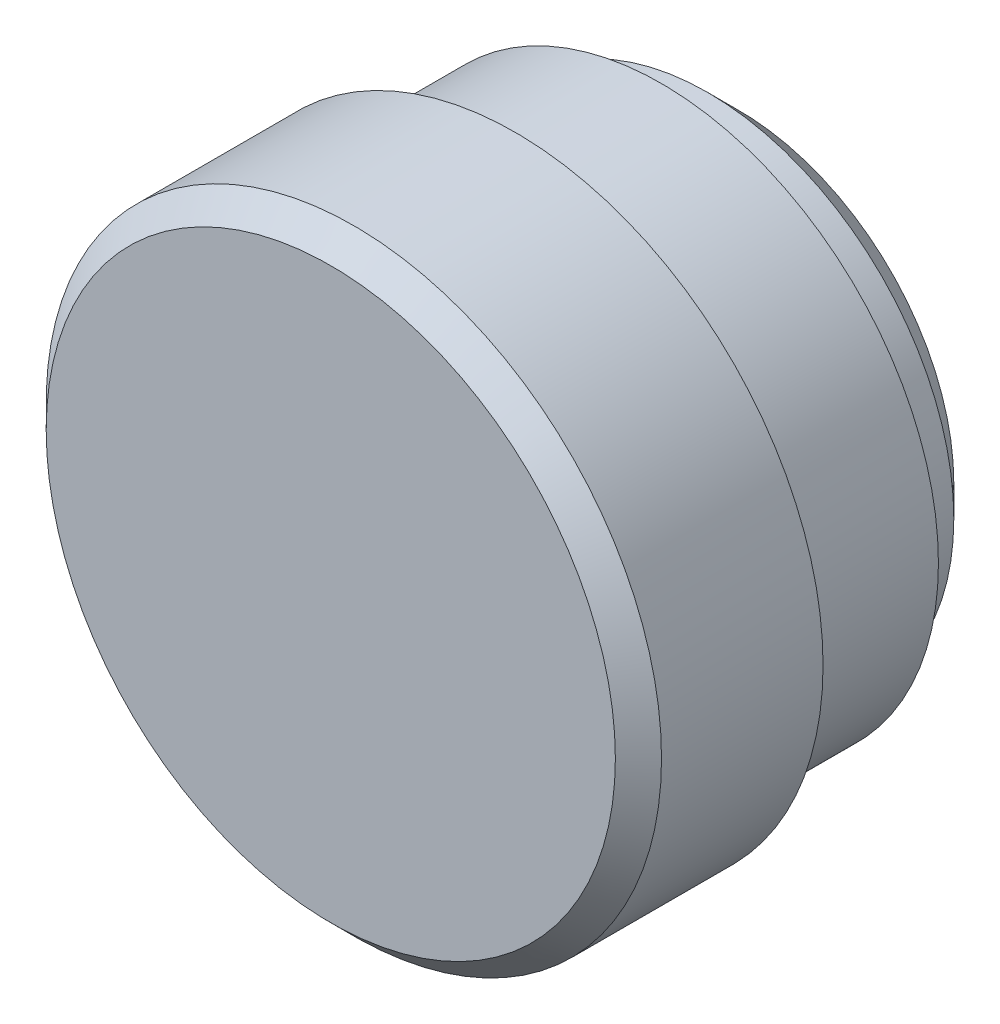
ISO-10303-21;
HEADER;
FILE_DESCRIPTION(('STEP AP214'),'2;1');
FILE_NAME('part.step','',(''),(''),'','','');
FILE_SCHEMA(('AUTOMOTIVE_DESIGN { 1 0 10303 214 1 1 1 1 }'));
ENDSEC;
DATA;
#1=APPLICATION_CONTEXT('core data for automotive mechanical design processes');
#2=APPLICATION_PROTOCOL_DEFINITION('international standard','automotive_design',2000,#1);
#3=PRODUCT_CONTEXT('',#1,'mechanical');
#4=PRODUCT('Part','Part','',(#3));
#5=PRODUCT_RELATED_PRODUCT_CATEGORY('part','',(#4));
#6=PRODUCT_DEFINITION_FORMATION('','',#4);
#7=PRODUCT_DEFINITION_CONTEXT('part definition',#1,'design');
#8=PRODUCT_DEFINITION('design','',#6,#7);
#9=PRODUCT_DEFINITION_SHAPE('','',#8);
#10=(LENGTH_UNIT() NAMED_UNIT(*) SI_UNIT(.MILLI.,.METRE.));
#11=(NAMED_UNIT(*) PLANE_ANGLE_UNIT() SI_UNIT($,.RADIAN.));
#12=(NAMED_UNIT(*) SI_UNIT($,.STERADIAN.) SOLID_ANGLE_UNIT());
#13=UNCERTAINTY_MEASURE_WITH_UNIT(LENGTH_MEASURE(1.E-05),#10,'distance_accuracy_value','');
#14=(GEOMETRIC_REPRESENTATION_CONTEXT(3) GLOBAL_UNCERTAINTY_ASSIGNED_CONTEXT((#13)) GLOBAL_UNIT_ASSIGNED_CONTEXT((#10,
#11,#12)) REPRESENTATION_CONTEXT('',''));
#15=CARTESIAN_POINT('',(0.,0.,0.));
#16=DIRECTION('',(0.,0.,1.));
#17=DIRECTION('',(1.,0.,0.));
#18=AXIS2_PLACEMENT_3D('',#15,#16,#17);
#19=CARTESIAN_POINT('',(0.,0.,2.5));
#20=DIRECTION('',(0.,0.,-1.));
#21=DIRECTION('',(-1.,0.,0.));
#22=AXIS2_PLACEMENT_3D('',#19,#20,#21);
#23=CYLINDRICAL_SURFACE('',#22,8.);
#24=CARTESIAN_POINT('',(0.,0.,1.));
#25=DIRECTION('',(0.,0.,1.));
#26=DIRECTION('',(1.,0.,0.));
#27=AXIS2_PLACEMENT_3D('',#24,#25,#26);
#28=CIRCLE('',#27,8.);
#29=CARTESIAN_POINT('',(8.,0.,1.));
#30=VERTEX_POINT('',#29);
#31=EDGE_CURVE('E130',#30,#30,#28,.T.);
#32=ORIENTED_EDGE('',*,*,#31,.T.);
#33=EDGE_LOOP('',(#32));
#34=FACE_BOUND('',#33,.T.);
#35=CARTESIAN_POINT('',(0.,0.,2.5));
#36=DIRECTION('',(0.,0.,1.));
#37=DIRECTION('',(1.,0.,0.));
#38=AXIS2_PLACEMENT_3D('',#35,#36,#37);
#39=CIRCLE('',#38,8.);
#40=CARTESIAN_POINT('',(8.,0.,2.5));
#41=VERTEX_POINT('',#40);
#42=EDGE_CURVE('E131',#41,#41,#39,.T.);
#43=ORIENTED_EDGE('',*,*,#42,.F.);
#44=EDGE_LOOP('',(#43));
#45=FACE_BOUND('',#44,.T.);
#46=ADVANCED_FACE('F41',(#34,#45),#23,.T.);
#47=CARTESIAN_POINT('',(0.,0.,0.));
#48=DIRECTION('',(0.,0.,1.));
#49=DIRECTION('',(1.,0.,0.));
#50=AXIS2_PLACEMENT_3D('',#47,#48,#49);
#51=PLANE('',#50);
#52=CARTESIAN_POINT('',(0.,0.,0.));
#53=DIRECTION('',(0.,0.,1.));
#54=DIRECTION('',(1.,0.,0.));
#55=AXIS2_PLACEMENT_3D('',#52,#53,#54);
#56=CIRCLE('',#55,7.);
#57=CARTESIAN_POINT('',(7.,0.,0.));
#58=VERTEX_POINT('',#57);
#59=EDGE_CURVE('E141',#58,#58,#56,.F.);
#60=ORIENTED_EDGE('',*,*,#59,.T.);
#61=EDGE_LOOP('',(#60));
#62=FACE_BOUND('',#61,.T.);
#63=DIRECTION('',(-1.,0.,0.));
#64=VECTOR('',#63,1.);
#65=CARTESIAN_POINT('',(2.5,-2.5,0.));
#66=LINE('',#65,#64);
#67=CARTESIAN_POINT('',(2.5,-2.5,0.));
#68=VERTEX_POINT('',#67);
#69=CARTESIAN_POINT('',(-2.5,-2.5,0.));
#70=VERTEX_POINT('',#69);
#71=EDGE_CURVE('E92',#68,#70,#66,.T.);
#72=ORIENTED_EDGE('',*,*,#71,.F.);
#73=DIRECTION('',(0.,-1.,0.));
#74=VECTOR('',#73,1.);
#75=CARTESIAN_POINT('',(2.5,2.5,0.));
#76=LINE('',#75,#74);
#77=CARTESIAN_POINT('',(2.5,2.5,0.));
#78=VERTEX_POINT('',#77);
#79=EDGE_CURVE('E57',#78,#68,#76,.T.);
#80=ORIENTED_EDGE('',*,*,#79,.F.);
#81=DIRECTION('',(1.,0.,0.));
#82=VECTOR('',#81,1.);
#83=CARTESIAN_POINT('',(2.5,2.5,0.));
#84=LINE('',#83,#82);
#85=CARTESIAN_POINT('',(-2.5,2.5,0.));
#86=VERTEX_POINT('',#85);
#87=EDGE_CURVE('E108',#86,#78,#84,.T.);
#88=ORIENTED_EDGE('',*,*,#87,.F.);
#89=DIRECTION('',(0.,1.,0.));
#90=VECTOR('',#89,1.);
#91=CARTESIAN_POINT('',(-2.5,2.5,0.));
#92=LINE('',#91,#90);
#93=EDGE_CURVE('E114',#70,#86,#92,.T.);
#94=ORIENTED_EDGE('',*,*,#93,.F.);
#95=EDGE_LOOP('',(#72,#80,#88,#94));
#96=FACE_BOUND('',#95,.T.);
#97=ADVANCED_FACE('F158',(#62,#96),#51,.F.);
#98=CARTESIAN_POINT('',(0.,0.,7.));
#99=DIRECTION('',(0.,0.,-1.));
#100=DIRECTION('',(-1.,0.,0.));
#101=AXIS2_PLACEMENT_3D('',#98,#99,#100);
#102=CYLINDRICAL_SURFACE('',#101,9.);
#103=CARTESIAN_POINT('',(0.,0.,7.));
#104=DIRECTION('',(0.,0.,1.));
#105=DIRECTION('',(1.,0.,0.));
#106=AXIS2_PLACEMENT_3D('',#103,#104,#105);
#107=CIRCLE('',#106,9.);
#108=CARTESIAN_POINT('',(9.,0.,7.));
#109=VERTEX_POINT('',#108);
#110=EDGE_CURVE('E132',#109,#109,#107,.T.);
#111=ORIENTED_EDGE('',*,*,#110,.F.);
#112=EDGE_LOOP('',(#111));
#113=FACE_BOUND('',#112,.T.);
#114=CARTESIAN_POINT('',(0.,0.,2.5));
#115=DIRECTION('',(0.,0.,1.));
#116=DIRECTION('',(1.,0.,0.));
#117=AXIS2_PLACEMENT_3D('',#114,#115,#116);
#118=CIRCLE('',#117,9.);
#119=CARTESIAN_POINT('',(9.,0.,2.5));
#120=VERTEX_POINT('',#119);
#121=EDGE_CURVE('E126',#120,#120,#118,.T.);
#122=ORIENTED_EDGE('',*,*,#121,.T.);
#123=EDGE_LOOP('',(#122));
#124=FACE_BOUND('',#123,.T.);
#125=ADVANCED_FACE('F165',(#113,#124),#102,.T.);
#126=CARTESIAN_POINT('',(0.,0.,7.));
#127=DIRECTION('',(0.,0.,1.));
#128=DIRECTION('',(1.,0.,0.));
#129=AXIS2_PLACEMENT_3D('',#126,#127,#128);
#130=PLANE('',#129);
#131=CARTESIAN_POINT('',(0.,0.,7.));
#132=DIRECTION('',(0.,0.,1.));
#133=DIRECTION('',(1.,0.,0.));
#134=AXIS2_PLACEMENT_3D('',#131,#132,#133);
#135=CIRCLE('',#134,8.);
#136=CARTESIAN_POINT('',(8.,0.,7.));
#137=VERTEX_POINT('',#136);
#138=EDGE_CURVE('E127',#137,#137,#135,.T.);
#139=ORIENTED_EDGE('',*,*,#138,.F.);
#140=EDGE_LOOP('',(#139));
#141=FACE_BOUND('',#140,.T.);
#142=ORIENTED_EDGE('',*,*,#110,.T.);
#143=EDGE_LOOP('',(#142));
#144=FACE_BOUND('',#143,.T.);
#145=ADVANCED_FACE('F177',(#141,#144),#130,.T.);
#146=CARTESIAN_POINT('',(0.,0.,2.5));
#147=DIRECTION('',(0.,0.,1.));
#148=DIRECTION('',(1.,0.,0.));
#149=AXIS2_PLACEMENT_3D('',#146,#147,#148);
#150=PLANE('',#149);
#151=ORIENTED_EDGE('',*,*,#42,.T.);
#152=EDGE_LOOP('',(#151));
#153=FACE_BOUND('',#152,.T.);
#154=ORIENTED_EDGE('',*,*,#121,.F.);
#155=EDGE_LOOP('',(#154));
#156=FACE_BOUND('',#155,.T.);
#157=ADVANCED_FACE('F179',(#153,#156),#150,.F.);
#158=CARTESIAN_POINT('',(0.,0.,7.25));
#159=DIRECTION('',(0.,0.,-1.));
#160=DIRECTION('',(-1.,0.,0.));
#161=AXIS2_PLACEMENT_3D('',#158,#159,#160);
#162=CYLINDRICAL_SURFACE('',#161,8.);
#163=CARTESIAN_POINT('',(0.,0.,7.25));
#164=DIRECTION('',(0.,0.,1.));
#165=DIRECTION('',(1.,0.,0.));
#166=AXIS2_PLACEMENT_3D('',#163,#164,#165);
#167=CIRCLE('',#166,8.);
#168=CARTESIAN_POINT('',(8.,0.,7.25));
#169=VERTEX_POINT('',#168);
#170=EDGE_CURVE('E123',#169,#169,#167,.T.);
#171=ORIENTED_EDGE('',*,*,#170,.F.);
#172=EDGE_LOOP('',(#171));
#173=FACE_BOUND('',#172,.T.);
#174=ORIENTED_EDGE('',*,*,#138,.T.);
#175=EDGE_LOOP('',(#174));
#176=FACE_BOUND('',#175,.T.);
#177=ADVANCED_FACE('F182',(#173,#176),#162,.T.);
#178=CARTESIAN_POINT('',(0.,0.,13.25));
#179=DIRECTION('',(0.,0.,-1.));
#180=DIRECTION('',(-1.,0.,0.));
#181=AXIS2_PLACEMENT_3D('',#178,#179,#180);
#182=CYLINDRICAL_SURFACE('',#181,10.);
#183=CARTESIAN_POINT('',(0.,0.,12.5));
#184=DIRECTION('',(0.,0.,1.));
#185=DIRECTION('',(1.,0.,0.));
#186=AXIS2_PLACEMENT_3D('',#183,#184,#185);
#187=CIRCLE('',#186,10.);
#188=CARTESIAN_POINT('',(10.,0.,12.5));
#189=VERTEX_POINT('',#188);
#190=EDGE_CURVE('E11',#189,#189,#187,.F.);
#191=ORIENTED_EDGE('',*,*,#190,.T.);
#192=EDGE_LOOP('',(#191));
#193=FACE_BOUND('',#192,.T.);
#194=CARTESIAN_POINT('',(0.,0.,7.25));
#195=DIRECTION('',(0.,0.,1.));
#196=DIRECTION('',(1.,0.,0.));
#197=AXIS2_PLACEMENT_3D('',#194,#195,#196);
#198=CIRCLE('',#197,10.);
#199=CARTESIAN_POINT('',(10.,0.,7.25));
#200=VERTEX_POINT('',#199);
#201=EDGE_CURVE('E118',#200,#200,#198,.T.);
#202=ORIENTED_EDGE('',*,*,#201,.T.);
#203=EDGE_LOOP('',(#202));
#204=FACE_BOUND('',#203,.T.);
#205=ADVANCED_FACE('F189',(#193,#204),#182,.T.);
#206=CARTESIAN_POINT('',(0.,0.,13.25));
#207=DIRECTION('',(0.,0.,1.));
#208=DIRECTION('',(1.,0.,0.));
#209=AXIS2_PLACEMENT_3D('',#206,#207,#208);
#210=PLANE('',#209);
#211=CARTESIAN_POINT('',(0.,0.,13.25));
#212=DIRECTION('',(0.,0.,1.));
#213=DIRECTION('',(1.,0.,0.));
#214=AXIS2_PLACEMENT_3D('',#211,#212,#213);
#215=CIRCLE('',#214,9.25);
#216=CARTESIAN_POINT('',(9.25,0.,13.25));
#217=VERTEX_POINT('',#216);
#218=EDGE_CURVE('E50',#217,#217,#215,.T.);
#219=ORIENTED_EDGE('',*,*,#218,.T.);
#220=EDGE_LOOP('',(#219));
#221=FACE_BOUND('',#220,.T.);
#222=ADVANCED_FACE('F146',(#221),#210,.T.);
#223=CARTESIAN_POINT('',(0.,0.,7.25));
#224=DIRECTION('',(0.,0.,1.));
#225=DIRECTION('',(1.,0.,0.));
#226=AXIS2_PLACEMENT_3D('',#223,#224,#225);
#227=PLANE('',#226);
#228=ORIENTED_EDGE('',*,*,#170,.T.);
#229=EDGE_LOOP('',(#228));
#230=FACE_BOUND('',#229,.T.);
#231=ORIENTED_EDGE('',*,*,#201,.F.);
#232=EDGE_LOOP('',(#231));
#233=FACE_BOUND('',#232,.T.);
#234=ADVANCED_FACE('F194',(#230,#233),#227,.F.);
#235=CARTESIAN_POINT('',(2.5,2.5,5.));
#236=DIRECTION('',(1.,0.,0.));
#237=DIRECTION('',(0.,0.,-1.));
#238=AXIS2_PLACEMENT_3D('',#235,#236,#237);
#239=PLANE('',#238);
#240=ORIENTED_EDGE('',*,*,#79,.T.);
#241=DIRECTION('',(0.,0.,-1.));
#242=VECTOR('',#241,1.);
#243=CARTESIAN_POINT('',(2.5,-2.5,5.));
#244=LINE('',#243,#242);
#245=CARTESIAN_POINT('',(2.5,-2.5,5.));
#246=VERTEX_POINT('',#245);
#247=EDGE_CURVE('E80',#246,#68,#244,.T.);
#248=ORIENTED_EDGE('',*,*,#247,.F.);
#249=DIRECTION('',(0.,-1.,0.));
#250=VECTOR('',#249,1.);
#251=CARTESIAN_POINT('',(2.5,2.5,5.));
#252=LINE('',#251,#250);
#253=CARTESIAN_POINT('',(2.5,2.5,5.));
#254=VERTEX_POINT('',#253);
#255=EDGE_CURVE('E106',#254,#246,#252,.T.);
#256=ORIENTED_EDGE('',*,*,#255,.F.);
#257=DIRECTION('',(0.,0.,-1.));
#258=VECTOR('',#257,1.);
#259=CARTESIAN_POINT('',(2.5,2.5,5.));
#260=LINE('',#259,#258);
#261=EDGE_CURVE('E65',#254,#78,#260,.T.);
#262=ORIENTED_EDGE('',*,*,#261,.T.);
#263=EDGE_LOOP('',(#240,#248,#256,#262));
#264=FACE_BOUND('',#263,.T.);
#265=ADVANCED_FACE('F197',(#264),#239,.F.);
#266=CARTESIAN_POINT('',(2.5,2.5,5.));
#267=DIRECTION('',(0.,1.,0.));
#268=DIRECTION('',(0.,0.,1.));
#269=AXIS2_PLACEMENT_3D('',#266,#267,#268);
#270=PLANE('',#269);
#271=ORIENTED_EDGE('',*,*,#87,.T.);
#272=ORIENTED_EDGE('',*,*,#261,.F.);
#273=DIRECTION('',(1.,0.,0.));
#274=VECTOR('',#273,1.);
#275=CARTESIAN_POINT('',(2.5,2.5,5.));
#276=LINE('',#275,#274);
#277=CARTESIAN_POINT('',(-2.5,2.5,5.));
#278=VERTEX_POINT('',#277);
#279=EDGE_CURVE('E103',#278,#254,#276,.T.);
#280=ORIENTED_EDGE('',*,*,#279,.F.);
#281=DIRECTION('',(0.,0.,-1.));
#282=VECTOR('',#281,1.);
#283=CARTESIAN_POINT('',(-2.5,2.5,5.));
#284=LINE('',#283,#282);
#285=EDGE_CURVE('E96',#278,#86,#284,.T.);
#286=ORIENTED_EDGE('',*,*,#285,.T.);
#287=EDGE_LOOP('',(#271,#272,#280,#286));
#288=FACE_BOUND('',#287,.T.);
#289=ADVANCED_FACE('F202',(#288),#270,.F.);
#290=CARTESIAN_POINT('',(-2.5,2.5,5.));
#291=DIRECTION('',(-1.,0.,0.));
#292=DIRECTION('',(0.,0.,1.));
#293=AXIS2_PLACEMENT_3D('',#290,#291,#292);
#294=PLANE('',#293);
#295=ORIENTED_EDGE('',*,*,#93,.T.);
#296=ORIENTED_EDGE('',*,*,#285,.F.);
#297=DIRECTION('',(0.,1.,0.));
#298=VECTOR('',#297,1.);
#299=CARTESIAN_POINT('',(-2.5,2.5,5.));
#300=LINE('',#299,#298);
#301=CARTESIAN_POINT('',(-2.5,-2.5,5.));
#302=VERTEX_POINT('',#301);
#303=EDGE_CURVE('E99',#302,#278,#300,.T.);
#304=ORIENTED_EDGE('',*,*,#303,.F.);
#305=DIRECTION('',(0.,0.,-1.));
#306=VECTOR('',#305,1.);
#307=CARTESIAN_POINT('',(-2.5,-2.5,5.));
#308=LINE('',#307,#306);
#309=EDGE_CURVE('E85',#302,#70,#308,.T.);
#310=ORIENTED_EDGE('',*,*,#309,.T.);
#311=EDGE_LOOP('',(#295,#296,#304,#310));
#312=FACE_BOUND('',#311,.T.);
#313=ADVANCED_FACE('F100',(#312),#294,.F.);
#314=CARTESIAN_POINT('',(2.5,-2.5,5.));
#315=DIRECTION('',(0.,-1.,0.));
#316=DIRECTION('',(0.,0.,-1.));
#317=AXIS2_PLACEMENT_3D('',#314,#315,#316);
#318=PLANE('',#317);
#319=ORIENTED_EDGE('',*,*,#71,.T.);
#320=ORIENTED_EDGE('',*,*,#309,.F.);
#321=DIRECTION('',(-1.,0.,0.));
#322=VECTOR('',#321,1.);
#323=CARTESIAN_POINT('',(2.5,-2.5,5.));
#324=LINE('',#323,#322);
#325=EDGE_CURVE('E89',#246,#302,#324,.T.);
#326=ORIENTED_EDGE('',*,*,#325,.F.);
#327=ORIENTED_EDGE('',*,*,#247,.T.);
#328=EDGE_LOOP('',(#319,#320,#326,#327));
#329=FACE_BOUND('',#328,.T.);
#330=ADVANCED_FACE('F87',(#329),#318,.F.);
#331=CARTESIAN_POINT('',(0.,0.,5.));
#332=DIRECTION('',(0.,0.,-1.));
#333=DIRECTION('',(-1.,0.,0.));
#334=AXIS2_PLACEMENT_3D('',#331,#332,#333);
#335=PLANE('',#334);
#336=ORIENTED_EDGE('',*,*,#255,.T.);
#337=ORIENTED_EDGE('',*,*,#325,.T.);
#338=ORIENTED_EDGE('',*,*,#303,.T.);
#339=ORIENTED_EDGE('',*,*,#279,.T.);
#340=EDGE_LOOP('',(#336,#337,#338,#339));
#341=FACE_BOUND('',#340,.T.);
#342=ADVANCED_FACE('F105',(#341),#335,.T.);
#343=CARTESIAN_POINT('',(0.,0.,1.));
#344=DIRECTION('',(0.,0.,1.));
#345=DIRECTION('',(1.,0.,0.));
#346=AXIS2_PLACEMENT_3D('',#343,#344,#345);
#347=CONICAL_SURFACE('',#346,8.,0.78539816339745);
#348=ORIENTED_EDGE('',*,*,#59,.F.);
#349=EDGE_LOOP('',(#348));
#350=FACE_BOUND('',#349,.T.);
#351=ORIENTED_EDGE('',*,*,#31,.F.);
#352=EDGE_LOOP('',(#351));
#353=FACE_BOUND('',#352,.T.);
#354=ADVANCED_FACE('F149',(#350,#353),#347,.T.);
#355=CARTESIAN_POINT('',(0.,0.,13.25));
#356=DIRECTION('',(0.,0.,-1.));
#357=DIRECTION('',(-1.,0.,0.));
#358=AXIS2_PLACEMENT_3D('',#355,#356,#357);
#359=CONICAL_SURFACE('',#358,9.25,0.785398163397441);
#360=ORIENTED_EDGE('',*,*,#190,.F.);
#361=EDGE_LOOP('',(#360));
#362=FACE_BOUND('',#361,.T.);
#363=ORIENTED_EDGE('',*,*,#218,.F.);
#364=EDGE_LOOP('',(#363));
#365=FACE_BOUND('',#364,.T.);
#366=ADVANCED_FACE('F44',(#362,#365),#359,.T.);
#367=CLOSED_SHELL('',(#46,#97,#125,#145,#157,#177,#205,#222,#234,#265,#289,#313,#330,#342,#354,#366));
#368=MANIFOLD_SOLID_BREP('B2',#367);
#369=ADVANCED_BREP_SHAPE_REPRESENTATION('',(#18,#368),#14);
#370=SHAPE_DEFINITION_REPRESENTATION(#9,#369);
ENDSEC;
END-ISO-10303-21;
